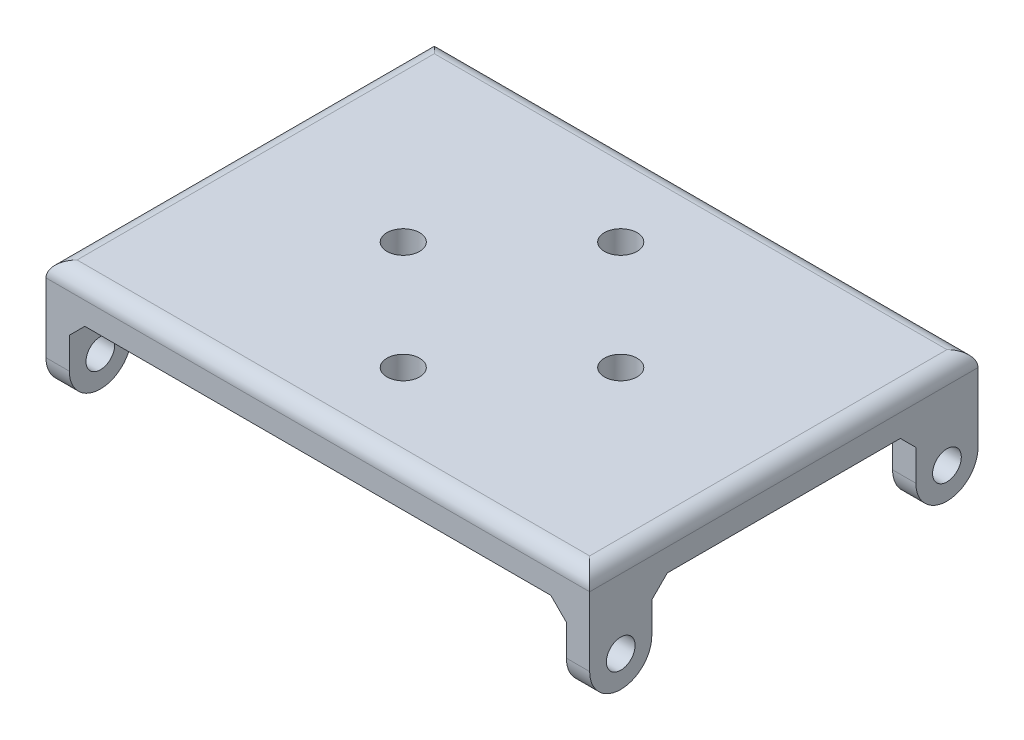
ISO-10303-21;
HEADER;
FILE_DESCRIPTION(('STEP AP214'),'2;1');
FILE_NAME('part.step','',(''),(''),'','','');
FILE_SCHEMA(('AUTOMOTIVE_DESIGN { 1 0 10303 214 1 1 1 1 }'));
ENDSEC;
DATA;
#1=APPLICATION_CONTEXT('core data for automotive mechanical design processes');
#2=APPLICATION_PROTOCOL_DEFINITION('international standard','automotive_design',2000,#1);
#3=PRODUCT_CONTEXT('',#1,'mechanical');
#4=PRODUCT('Part','Part','',(#3));
#5=PRODUCT_RELATED_PRODUCT_CATEGORY('part','',(#4));
#6=PRODUCT_DEFINITION_FORMATION('','',#4);
#7=PRODUCT_DEFINITION_CONTEXT('part definition',#1,'design');
#8=PRODUCT_DEFINITION('design','',#6,#7);
#9=PRODUCT_DEFINITION_SHAPE('','',#8);
#10=(LENGTH_UNIT() NAMED_UNIT(*) SI_UNIT(.MILLI.,.METRE.));
#11=(NAMED_UNIT(*) PLANE_ANGLE_UNIT() SI_UNIT($,.RADIAN.));
#12=(NAMED_UNIT(*) SI_UNIT($,.STERADIAN.) SOLID_ANGLE_UNIT());
#13=UNCERTAINTY_MEASURE_WITH_UNIT(LENGTH_MEASURE(1.E-05),#10,'distance_accuracy_value','');
#14=(GEOMETRIC_REPRESENTATION_CONTEXT(3) GLOBAL_UNCERTAINTY_ASSIGNED_CONTEXT((#13)) GLOBAL_UNIT_ASSIGNED_CONTEXT((#10,
#11,#12)) REPRESENTATION_CONTEXT('',''));
#15=CARTESIAN_POINT('',(0.,0.,0.));
#16=DIRECTION('',(0.,0.,1.));
#17=DIRECTION('',(1.,0.,0.));
#18=AXIS2_PLACEMENT_3D('',#15,#16,#17);
#19=CARTESIAN_POINT('',(0.,-1.225,0.));
#20=DIRECTION('',(0.,-1.,0.));
#21=DIRECTION('',(0.,0.,-1.));
#22=AXIS2_PLACEMENT_3D('',#19,#20,#21);
#23=PLANE('',#22);
#24=CARTESIAN_POINT('',(0.,-1.225,-7.));
#25=DIRECTION('',(0.,-1.,0.));
#26=DIRECTION('',(0.,0.,-1.));
#27=AXIS2_PLACEMENT_3D('',#24,#25,#26);
#28=CIRCLE('',#27,1.05);
#29=CARTESIAN_POINT('',(0.,-1.225,-8.05));
#30=VERTEX_POINT('',#29);
#31=EDGE_CURVE('E410',#30,#30,#28,.T.);
#32=ORIENTED_EDGE('',*,*,#31,.F.);
#33=EDGE_LOOP('',(#32));
#34=FACE_BOUND('',#33,.T.);
#35=CARTESIAN_POINT('',(7.,-1.225,0.));
#36=DIRECTION('',(0.,-1.,0.));
#37=DIRECTION('',(0.,0.,-1.));
#38=AXIS2_PLACEMENT_3D('',#35,#36,#37);
#39=CIRCLE('',#38,1.05);
#40=CARTESIAN_POINT('',(7.,-1.225,-1.05));
#41=VERTEX_POINT('',#40);
#42=EDGE_CURVE('E917',#41,#41,#39,.T.);
#43=ORIENTED_EDGE('',*,*,#42,.F.);
#44=EDGE_LOOP('',(#43));
#45=FACE_BOUND('',#44,.T.);
#46=CARTESIAN_POINT('',(-7.,-1.225,0.));
#47=DIRECTION('',(0.,-1.,0.));
#48=DIRECTION('',(0.,0.,-1.));
#49=AXIS2_PLACEMENT_3D('',#46,#47,#48);
#50=CIRCLE('',#49,1.05);
#51=CARTESIAN_POINT('',(-7.,-1.225,-1.05));
#52=VERTEX_POINT('',#51);
#53=EDGE_CURVE('E904',#52,#52,#50,.T.);
#54=ORIENTED_EDGE('',*,*,#53,.F.);
#55=EDGE_LOOP('',(#54));
#56=FACE_BOUND('',#55,.T.);
#57=CARTESIAN_POINT('',(0.,-1.225,7.));
#58=DIRECTION('',(0.,-1.,0.));
#59=DIRECTION('',(0.,0.,-1.));
#60=AXIS2_PLACEMENT_3D('',#57,#58,#59);
#61=CIRCLE('',#60,1.05);
#62=CARTESIAN_POINT('',(0.,-1.225,5.95));
#63=VERTEX_POINT('',#62);
#64=EDGE_CURVE('E900',#63,#63,#61,.T.);
#65=ORIENTED_EDGE('',*,*,#64,.F.);
#66=EDGE_LOOP('',(#65));
#67=FACE_BOUND('',#66,.T.);
#68=DIRECTION('',(-1.,0.,0.));
#69=VECTOR('',#68,1.);
#70=CARTESIAN_POINT('',(-17.5,-1.225,-12.5));
#71=LINE('',#70,#69);
#72=CARTESIAN_POINT('',(15.,-1.225,-12.5));
#73=VERTEX_POINT('',#72);
#74=CARTESIAN_POINT('',(-15.,-1.225,-12.5));
#75=VERTEX_POINT('',#74);
#76=EDGE_CURVE('E306',#73,#75,#71,.T.);
#77=ORIENTED_EDGE('',*,*,#76,.F.);
#78=DIRECTION('',(0.,0.,1.));
#79=VECTOR('',#78,1.);
#80=CARTESIAN_POINT('',(15.,-1.225,0.));
#81=LINE('',#80,#79);
#82=CARTESIAN_POINT('',(15.,-1.225,-7.49999999999999));
#83=VERTEX_POINT('',#82);
#84=EDGE_CURVE('E352',#73,#83,#81,.T.);
#85=ORIENTED_EDGE('',*,*,#84,.T.);
#86=DIRECTION('',(1.,0.,0.));
#87=VECTOR('',#86,1.);
#88=CARTESIAN_POINT('',(0.,-1.225,-7.49999999999999));
#89=LINE('',#88,#87);
#90=CARTESIAN_POINT('',(17.5,-1.225,-7.49999999999999));
#91=VERTEX_POINT('',#90);
#92=EDGE_CURVE('E350',#83,#91,#89,.T.);
#93=ORIENTED_EDGE('',*,*,#92,.T.);
#94=DIRECTION('',(0.,0.,-1.));
#95=VECTOR('',#94,1.);
#96=CARTESIAN_POINT('',(17.5,-1.225,12.5));
#97=LINE('',#96,#95);
#98=CARTESIAN_POINT('',(17.5,-1.225,7.50000000000001));
#99=VERTEX_POINT('',#98);
#100=EDGE_CURVE('E301',#99,#91,#97,.T.);
#101=ORIENTED_EDGE('',*,*,#100,.F.);
#102=DIRECTION('',(-1.,0.,0.));
#103=VECTOR('',#102,1.);
#104=CARTESIAN_POINT('',(0.,-1.225,7.50000000000001));
#105=LINE('',#104,#103);
#106=CARTESIAN_POINT('',(15.,-1.225,7.50000000000001));
#107=VERTEX_POINT('',#106);
#108=EDGE_CURVE('E346',#99,#107,#105,.T.);
#109=ORIENTED_EDGE('',*,*,#108,.T.);
#110=DIRECTION('',(0.,0.,1.));
#111=VECTOR('',#110,1.);
#112=CARTESIAN_POINT('',(15.,-1.225,12.5));
#113=LINE('',#112,#111);
#114=CARTESIAN_POINT('',(15.,-1.225,12.5));
#115=VERTEX_POINT('',#114);
#116=EDGE_CURVE('E348',#107,#115,#113,.T.);
#117=ORIENTED_EDGE('',*,*,#116,.T.);
#118=DIRECTION('',(1.,0.,0.));
#119=VECTOR('',#118,1.);
#120=CARTESIAN_POINT('',(-17.5,-1.225,12.5));
#121=LINE('',#120,#119);
#122=CARTESIAN_POINT('',(-15.,-1.225,12.5));
#123=VERTEX_POINT('',#122);
#124=EDGE_CURVE('E312',#123,#115,#121,.T.);
#125=ORIENTED_EDGE('',*,*,#124,.F.);
#126=DIRECTION('',(0.,0.,-1.));
#127=VECTOR('',#126,1.);
#128=CARTESIAN_POINT('',(-15.,-1.225,8.5));
#129=LINE('',#128,#127);
#130=CARTESIAN_POINT('',(-15.,-1.225,7.49999999999999));
#131=VERTEX_POINT('',#130);
#132=EDGE_CURVE('E343',#123,#131,#129,.T.);
#133=ORIENTED_EDGE('',*,*,#132,.T.);
#134=DIRECTION('',(-1.,0.,0.));
#135=VECTOR('',#134,1.);
#136=CARTESIAN_POINT('',(-17.5,-1.225,7.49999999999999));
#137=LINE('',#136,#135);
#138=CARTESIAN_POINT('',(-17.5,-1.225,7.49999999999999));
#139=VERTEX_POINT('',#138);
#140=EDGE_CURVE('E341',#131,#139,#137,.T.);
#141=ORIENTED_EDGE('',*,*,#140,.T.);
#142=DIRECTION('',(0.,0.,1.));
#143=VECTOR('',#142,1.);
#144=CARTESIAN_POINT('',(-17.5,-1.225,12.5));
#145=LINE('',#144,#143);
#146=CARTESIAN_POINT('',(-17.5,-1.225,-7.5));
#147=VERTEX_POINT('',#146);
#148=EDGE_CURVE('E309',#147,#139,#145,.T.);
#149=ORIENTED_EDGE('',*,*,#148,.F.);
#150=DIRECTION('',(1.,0.,0.));
#151=VECTOR('',#150,1.);
#152=CARTESIAN_POINT('',(-16.,-1.225,-7.5));
#153=LINE('',#152,#151);
#154=CARTESIAN_POINT('',(-15.,-1.225,-7.5));
#155=VERTEX_POINT('',#154);
#156=EDGE_CURVE('E336',#147,#155,#153,.T.);
#157=ORIENTED_EDGE('',*,*,#156,.T.);
#158=DIRECTION('',(0.,0.,-1.));
#159=VECTOR('',#158,1.);
#160=CARTESIAN_POINT('',(-15.,-1.225,0.));
#161=LINE('',#160,#159);
#162=EDGE_CURVE('E338',#155,#75,#161,.T.);
#163=ORIENTED_EDGE('',*,*,#162,.T.);
#164=EDGE_LOOP('',(#77,#85,#93,#101,#109,#117,#125,#133,#141,#149,#157,#163));
#165=FACE_BOUND('',#164,.T.);
#166=ADVANCED_FACE('F41',(#34,#45,#56,#67,#165),#23,.T.);
#167=CARTESIAN_POINT('',(17.5,1.225,12.5));
#168=DIRECTION('',(-1.,0.,0.));
#169=DIRECTION('',(0.,0.,1.));
#170=AXIS2_PLACEMENT_3D('',#167,#168,#169);
#171=PLANE('',#170);
#172=CARTESIAN_POINT('',(17.5,-4.225,-10.5));
#173=DIRECTION('',(-1.,0.,0.));
#174=DIRECTION('',(0.,0.,1.));
#175=AXIS2_PLACEMENT_3D('',#172,#173,#174);
#176=CIRCLE('',#175,0.925000000000001);
#177=CARTESIAN_POINT('',(17.5,-4.225,-9.575));
#178=VERTEX_POINT('',#177);
#179=EDGE_CURVE('E331',#178,#178,#176,.T.);
#180=ORIENTED_EDGE('',*,*,#179,.T.);
#181=EDGE_LOOP('',(#180));
#182=FACE_BOUND('',#181,.T.);
#183=CARTESIAN_POINT('',(17.5,-4.225,10.5));
#184=DIRECTION('',(-1.,0.,0.));
#185=DIRECTION('',(0.,0.,-1.));
#186=AXIS2_PLACEMENT_3D('',#183,#184,#185);
#187=CIRCLE('',#186,0.925000000000001);
#188=CARTESIAN_POINT('',(17.5,-4.225,9.575));
#189=VERTEX_POINT('',#188);
#190=EDGE_CURVE('E232',#189,#189,#187,.T.);
#191=ORIENTED_EDGE('',*,*,#190,.T.);
#192=EDGE_LOOP('',(#191));
#193=FACE_BOUND('',#192,.T.);
#194=DIRECTION('',(0.,-1.,0.));
#195=VECTOR('',#194,1.);
#196=CARTESIAN_POINT('',(17.5,1.225,-12.5));
#197=LINE('',#196,#195);
#198=CARTESIAN_POINT('',(17.5,0.225,-12.5));
#199=VERTEX_POINT('',#198);
#200=CARTESIAN_POINT('',(17.5,-4.225,-12.5));
#201=VERTEX_POINT('',#200);
#202=EDGE_CURVE('E321',#199,#201,#197,.T.);
#203=ORIENTED_EDGE('',*,*,#202,.F.);
#204=DIRECTION('',(0.,0.,-1.));
#205=VECTOR('',#204,1.);
#206=CARTESIAN_POINT('',(17.5,0.225,12.5));
#207=LINE('',#206,#205);
#208=CARTESIAN_POINT('',(17.5,0.225,12.5));
#209=VERTEX_POINT('',#208);
#210=EDGE_CURVE('E50',#199,#209,#207,.F.);
#211=ORIENTED_EDGE('',*,*,#210,.T.);
#212=DIRECTION('',(0.,-1.,0.));
#213=VECTOR('',#212,1.);
#214=CARTESIAN_POINT('',(17.5,1.225,12.5));
#215=LINE('',#214,#213);
#216=CARTESIAN_POINT('',(17.5,-4.225,12.5));
#217=VERTEX_POINT('',#216);
#218=EDGE_CURVE('E315',#209,#217,#215,.T.);
#219=ORIENTED_EDGE('',*,*,#218,.T.);
#220=CARTESIAN_POINT('',(17.5,-4.225,10.5));
#221=DIRECTION('',(-1.,0.,0.));
#222=DIRECTION('',(0.,0.,-1.));
#223=AXIS2_PLACEMENT_3D('',#220,#221,#222);
#224=CIRCLE('',#223,2.);
#225=CARTESIAN_POINT('',(17.5,-4.225,8.5));
#226=VERTEX_POINT('',#225);
#227=EDGE_CURVE('E229',#226,#217,#224,.T.);
#228=ORIENTED_EDGE('',*,*,#227,.F.);
#229=DIRECTION('',(0.,-1.,0.));
#230=VECTOR('',#229,1.);
#231=CARTESIAN_POINT('',(17.5,-4.225,8.5));
#232=LINE('',#231,#230);
#233=CARTESIAN_POINT('',(17.5,-2.225,8.5));
#234=VERTEX_POINT('',#233);
#235=EDGE_CURVE('E220',#234,#226,#232,.T.);
#236=ORIENTED_EDGE('',*,*,#235,.F.);
#237=DIRECTION('',(0.,0.70710678118655,-0.707106781186545));
#238=VECTOR('',#237,1.);
#239=CARTESIAN_POINT('',(17.5,-2.49999999999998,8.77499999999998));
#240=LINE('',#239,#238);
#241=EDGE_CURVE('E373',#234,#99,#240,.T.);
#242=ORIENTED_EDGE('',*,*,#241,.T.);
#243=ORIENTED_EDGE('',*,*,#100,.T.);
#244=DIRECTION('',(0.,-0.707106781186543,-0.707106781186552));
#245=VECTOR('',#244,1.);
#246=CARTESIAN_POINT('',(17.5,9.99999999999998,3.72500000000014));
#247=LINE('',#246,#245);
#248=CARTESIAN_POINT('',(17.5,-2.225,-8.5));
#249=VERTEX_POINT('',#248);
#250=EDGE_CURVE('E369',#91,#249,#247,.T.);
#251=ORIENTED_EDGE('',*,*,#250,.T.);
#252=DIRECTION('',(0.,1.,0.));
#253=VECTOR('',#252,1.);
#254=CARTESIAN_POINT('',(17.5,-4.225,-8.5));
#255=LINE('',#254,#253);
#256=CARTESIAN_POINT('',(17.5,-4.225,-8.5));
#257=VERTEX_POINT('',#256);
#258=EDGE_CURVE('E238',#257,#249,#255,.T.);
#259=ORIENTED_EDGE('',*,*,#258,.F.);
#260=CARTESIAN_POINT('',(17.5,-4.225,-10.5));
#261=DIRECTION('',(-1.,0.,0.));
#262=DIRECTION('',(0.,0.,1.));
#263=AXIS2_PLACEMENT_3D('',#260,#261,#262);
#264=CIRCLE('',#263,2.);
#265=EDGE_CURVE('E244',#201,#257,#264,.T.);
#266=ORIENTED_EDGE('',*,*,#265,.F.);
#267=EDGE_LOOP('',(#203,#211,#219,#228,#236,#242,#243,#251,#259,#266));
#268=FACE_BOUND('',#267,.T.);
#269=ADVANCED_FACE('F456',(#182,#193,#268),#171,.F.);
#270=CARTESIAN_POINT('',(-17.5,1.225,-12.5));
#271=DIRECTION('',(0.,0.,1.));
#272=DIRECTION('',(1.,0.,0.));
#273=AXIS2_PLACEMENT_3D('',#270,#271,#272);
#274=PLANE('',#273);
#275=DIRECTION('',(0.,-1.,0.));
#276=VECTOR('',#275,1.);
#277=CARTESIAN_POINT('',(-17.5,1.225,-12.5));
#278=LINE('',#277,#276);
#279=CARTESIAN_POINT('',(-17.5,0.225,-12.5));
#280=VERTEX_POINT('',#279);
#281=CARTESIAN_POINT('',(-17.5,-4.225,-12.5));
#282=VERTEX_POINT('',#281);
#283=EDGE_CURVE('E319',#280,#282,#278,.T.);
#284=ORIENTED_EDGE('',*,*,#283,.F.);
#285=DIRECTION('',(-1.,0.,0.));
#286=VECTOR('',#285,1.);
#287=CARTESIAN_POINT('',(-17.5,0.225,-12.5));
#288=LINE('',#287,#286);
#289=EDGE_CURVE('E65',#280,#199,#288,.F.);
#290=ORIENTED_EDGE('',*,*,#289,.T.);
#291=ORIENTED_EDGE('',*,*,#202,.T.);
#292=DIRECTION('',(1.,0.,0.));
#293=VECTOR('',#292,1.);
#294=CARTESIAN_POINT('',(16.,-4.225,-12.5));
#295=LINE('',#294,#293);
#296=CARTESIAN_POINT('',(16.,-4.225,-12.5));
#297=VERTEX_POINT('',#296);
#298=EDGE_CURVE('E252',#297,#201,#295,.T.);
#299=ORIENTED_EDGE('',*,*,#298,.F.);
#300=DIRECTION('',(0.,-1.,0.));
#301=VECTOR('',#300,1.);
#302=CARTESIAN_POINT('',(16.,-1.225,-12.5));
#303=LINE('',#302,#301);
#304=CARTESIAN_POINT('',(16.,-2.225,-12.5));
#305=VERTEX_POINT('',#304);
#306=EDGE_CURVE('E246',#305,#297,#303,.T.);
#307=ORIENTED_EDGE('',*,*,#306,.F.);
#308=DIRECTION('',(-0.707106781186552,0.707106781186543,0.));
#309=VECTOR('',#308,1.);
#310=CARTESIAN_POINT('',(-2.47500000000023,16.25,-12.5));
#311=LINE('',#310,#309);
#312=EDGE_CURVE('E367',#305,#73,#311,.T.);
#313=ORIENTED_EDGE('',*,*,#312,.T.);
#314=ORIENTED_EDGE('',*,*,#76,.T.);
#315=DIRECTION('',(-0.707106781186545,-0.70710678118655,0.));
#316=VECTOR('',#315,1.);
#317=CARTESIAN_POINT('',(-15.025,-1.24999999999999,-12.5));
#318=LINE('',#317,#316);
#319=CARTESIAN_POINT('',(-16.,-2.22500000000001,-12.5));
#320=VERTEX_POINT('',#319);
#321=EDGE_CURVE('E379',#75,#320,#318,.T.);
#322=ORIENTED_EDGE('',*,*,#321,.T.);
#323=DIRECTION('',(0.,-1.,0.));
#324=VECTOR('',#323,1.);
#325=CARTESIAN_POINT('',(-16.,-1.225,-12.5));
#326=LINE('',#325,#324);
#327=CARTESIAN_POINT('',(-16.,-4.225,-12.5));
#328=VERTEX_POINT('',#327);
#329=EDGE_CURVE('E285',#320,#328,#326,.T.);
#330=ORIENTED_EDGE('',*,*,#329,.T.);
#331=DIRECTION('',(-1.,0.,0.));
#332=VECTOR('',#331,1.);
#333=CARTESIAN_POINT('',(-16.,-4.225,-12.5));
#334=LINE('',#333,#332);
#335=EDGE_CURVE('E294',#328,#282,#334,.T.);
#336=ORIENTED_EDGE('',*,*,#335,.T.);
#337=EDGE_LOOP('',(#284,#290,#291,#299,#307,#313,#314,#322,#330,#336));
#338=FACE_BOUND('',#337,.T.);
#339=ADVANCED_FACE('F461',(#338),#274,.F.);
#340=CARTESIAN_POINT('',(-17.5,1.225,12.5));
#341=DIRECTION('',(1.,0.,0.));
#342=DIRECTION('',(0.,0.,-1.));
#343=AXIS2_PLACEMENT_3D('',#340,#341,#342);
#344=PLANE('',#343);
#345=CARTESIAN_POINT('',(-17.5,-4.225,-10.5));
#346=DIRECTION('',(-1.,0.,0.));
#347=DIRECTION('',(0.,0.,1.));
#348=AXIS2_PLACEMENT_3D('',#345,#346,#347);
#349=CIRCLE('',#348,0.925000000000001);
#350=CARTESIAN_POINT('',(-17.5,-4.225,-9.575));
#351=VERTEX_POINT('',#350);
#352=EDGE_CURVE('E258',#351,#351,#349,.T.);
#353=ORIENTED_EDGE('',*,*,#352,.F.);
#354=EDGE_LOOP('',(#353));
#355=FACE_BOUND('',#354,.T.);
#356=CARTESIAN_POINT('',(-17.5,-4.225,10.5));
#357=DIRECTION('',(-1.,0.,0.));
#358=DIRECTION('',(0.,0.,-1.));
#359=AXIS2_PLACEMENT_3D('',#356,#357,#358);
#360=CIRCLE('',#359,0.925000000000001);
#361=CARTESIAN_POINT('',(-17.5,-4.225,9.575));
#362=VERTEX_POINT('',#361);
#363=EDGE_CURVE('E255',#362,#362,#360,.T.);
#364=ORIENTED_EDGE('',*,*,#363,.F.);
#365=EDGE_LOOP('',(#364));
#366=FACE_BOUND('',#365,.T.);
#367=DIRECTION('',(0.,-1.,0.));
#368=VECTOR('',#367,1.);
#369=CARTESIAN_POINT('',(-17.5,1.225,12.5));
#370=LINE('',#369,#368);
#371=CARTESIAN_POINT('',(-17.5,0.225,12.5));
#372=VERTEX_POINT('',#371);
#373=CARTESIAN_POINT('',(-17.5,-4.225,12.5));
#374=VERTEX_POINT('',#373);
#375=EDGE_CURVE('E317',#372,#374,#370,.T.);
#376=ORIENTED_EDGE('',*,*,#375,.F.);
#377=DIRECTION('',(0.,0.,1.));
#378=VECTOR('',#377,1.);
#379=CARTESIAN_POINT('',(-17.5,0.225,12.5));
#380=LINE('',#379,#378);
#381=EDGE_CURVE('E402',#372,#280,#380,.F.);
#382=ORIENTED_EDGE('',*,*,#381,.T.);
#383=ORIENTED_EDGE('',*,*,#283,.T.);
#384=CARTESIAN_POINT('',(-17.5,-4.225,-10.5));
#385=DIRECTION('',(-1.,0.,0.));
#386=DIRECTION('',(0.,0.,1.));
#387=AXIS2_PLACEMENT_3D('',#384,#385,#386);
#388=CIRCLE('',#387,2.);
#389=CARTESIAN_POINT('',(-17.5,-4.225,-8.5));
#390=VERTEX_POINT('',#389);
#391=EDGE_CURVE('E278',#282,#390,#388,.T.);
#392=ORIENTED_EDGE('',*,*,#391,.T.);
#393=DIRECTION('',(0.,1.,0.));
#394=VECTOR('',#393,1.);
#395=CARTESIAN_POINT('',(-17.5,-4.225,-8.5));
#396=LINE('',#395,#394);
#397=CARTESIAN_POINT('',(-17.5,-2.22500000000001,-8.5));
#398=VERTEX_POINT('',#397);
#399=EDGE_CURVE('E288',#390,#398,#396,.T.);
#400=ORIENTED_EDGE('',*,*,#399,.T.);
#401=DIRECTION('',(0.,-0.707106781186551,-0.707106781186545));
#402=VECTOR('',#401,1.);
#403=CARTESIAN_POINT('',(-17.5,10.,3.72499999999992));
#404=LINE('',#403,#402);
#405=EDGE_CURVE('E381',#398,#147,#404,.F.);
#406=ORIENTED_EDGE('',*,*,#405,.T.);
#407=ORIENTED_EDGE('',*,*,#148,.T.);
#408=DIRECTION('',(0.,0.707106781186543,-0.707106781186552));
#409=VECTOR('',#408,1.);
#410=CARTESIAN_POINT('',(-17.5,-2.50000000000002,8.77500000000003));
#411=LINE('',#410,#409);
#412=CARTESIAN_POINT('',(-17.5,-2.225,8.5));
#413=VERTEX_POINT('',#412);
#414=EDGE_CURVE('E377',#139,#413,#411,.F.);
#415=ORIENTED_EDGE('',*,*,#414,.T.);
#416=DIRECTION('',(0.,-1.,0.));
#417=VECTOR('',#416,1.);
#418=CARTESIAN_POINT('',(-17.5,-4.225,8.5));
#419=LINE('',#418,#417);
#420=CARTESIAN_POINT('',(-17.5,-4.225,8.5));
#421=VERTEX_POINT('',#420);
#422=EDGE_CURVE('E272',#413,#421,#419,.T.);
#423=ORIENTED_EDGE('',*,*,#422,.T.);
#424=CARTESIAN_POINT('',(-17.5,-4.225,10.5));
#425=DIRECTION('',(-1.,0.,0.));
#426=DIRECTION('',(0.,0.,-1.));
#427=AXIS2_PLACEMENT_3D('',#424,#425,#426);
#428=CIRCLE('',#427,2.);
#429=EDGE_CURVE('E274',#421,#374,#428,.T.);
#430=ORIENTED_EDGE('',*,*,#429,.T.);
#431=EDGE_LOOP('',(#376,#382,#383,#392,#400,#406,#407,#415,#423,#430));
#432=FACE_BOUND('',#431,.T.);
#433=ADVANCED_FACE('F432',(#355,#366,#432),#344,.F.);
#434=CARTESIAN_POINT('',(-17.5,1.225,12.5));
#435=DIRECTION('',(0.,0.,-1.));
#436=DIRECTION('',(-1.,0.,0.));
#437=AXIS2_PLACEMENT_3D('',#434,#435,#436);
#438=PLANE('',#437);
#439=ORIENTED_EDGE('',*,*,#218,.F.);
#440=DIRECTION('',(1.,0.,0.));
#441=VECTOR('',#440,1.);
#442=CARTESIAN_POINT('',(-17.5,0.225,12.5));
#443=LINE('',#442,#441);
#444=EDGE_CURVE('E11',#209,#372,#443,.F.);
#445=ORIENTED_EDGE('',*,*,#444,.T.);
#446=ORIENTED_EDGE('',*,*,#375,.T.);
#447=DIRECTION('',(-1.,0.,0.));
#448=VECTOR('',#447,1.);
#449=CARTESIAN_POINT('',(-16.,-4.225,12.5));
#450=LINE('',#449,#448);
#451=CARTESIAN_POINT('',(-16.,-4.225,12.5));
#452=VERTEX_POINT('',#451);
#453=EDGE_CURVE('E264',#452,#374,#450,.T.);
#454=ORIENTED_EDGE('',*,*,#453,.F.);
#455=DIRECTION('',(0.,1.,0.));
#456=VECTOR('',#455,1.);
#457=CARTESIAN_POINT('',(-16.,-1.225,12.5));
#458=LINE('',#457,#456);
#459=CARTESIAN_POINT('',(-16.,-2.225,12.5));
#460=VERTEX_POINT('',#459);
#461=EDGE_CURVE('E280',#452,#460,#458,.T.);
#462=ORIENTED_EDGE('',*,*,#461,.T.);
#463=DIRECTION('',(-0.707106781186552,-0.707106781186543,0.));
#464=VECTOR('',#463,1.);
#465=CARTESIAN_POINT('',(-15.025,-1.25000000000002,12.5));
#466=LINE('',#465,#464);
#467=EDGE_CURVE('E375',#460,#123,#466,.F.);
#468=ORIENTED_EDGE('',*,*,#467,.T.);
#469=ORIENTED_EDGE('',*,*,#124,.T.);
#470=DIRECTION('',(-0.707106781186545,0.70710678118655,0.));
#471=VECTOR('',#470,1.);
#472=CARTESIAN_POINT('',(-2.47499999999987,16.25,12.5));
#473=LINE('',#472,#471);
#474=CARTESIAN_POINT('',(16.,-2.225,12.5));
#475=VERTEX_POINT('',#474);
#476=EDGE_CURVE('E371',#115,#475,#473,.F.);
#477=ORIENTED_EDGE('',*,*,#476,.T.);
#478=DIRECTION('',(0.,1.,0.));
#479=VECTOR('',#478,1.);
#480=CARTESIAN_POINT('',(16.,-1.225,12.5));
#481=LINE('',#480,#479);
#482=CARTESIAN_POINT('',(16.,-4.225,12.5));
#483=VERTEX_POINT('',#482);
#484=EDGE_CURVE('E214',#483,#475,#481,.T.);
#485=ORIENTED_EDGE('',*,*,#484,.F.);
#486=DIRECTION('',(1.,0.,0.));
#487=VECTOR('',#486,1.);
#488=CARTESIAN_POINT('',(16.,-4.225,12.5));
#489=LINE('',#488,#487);
#490=EDGE_CURVE('E224',#483,#217,#489,.T.);
#491=ORIENTED_EDGE('',*,*,#490,.T.);
#492=EDGE_LOOP('',(#439,#445,#446,#454,#462,#468,#469,#477,#485,#491));
#493=FACE_BOUND('',#492,.T.);
#494=ADVANCED_FACE('F429',(#493),#438,.F.);
#495=CARTESIAN_POINT('',(0.,1.225,0.));
#496=DIRECTION('',(0.,-1.,0.));
#497=DIRECTION('',(0.,0.,-1.));
#498=AXIS2_PLACEMENT_3D('',#495,#496,#497);
#499=PLANE('',#498);
#500=CARTESIAN_POINT('',(0.,1.225,-7.));
#501=DIRECTION('',(0.,1.,0.));
#502=DIRECTION('',(0.,0.,1.));
#503=AXIS2_PLACEMENT_3D('',#500,#501,#502);
#504=CIRCLE('',#503,1.05);
#505=CARTESIAN_POINT('',(0.,1.225,-5.95));
#506=VERTEX_POINT('',#505);
#507=EDGE_CURVE('E899',#506,#506,#504,.T.);
#508=ORIENTED_EDGE('',*,*,#507,.F.);
#509=EDGE_LOOP('',(#508));
#510=FACE_BOUND('',#509,.T.);
#511=CARTESIAN_POINT('',(7.,1.225,0.));
#512=DIRECTION('',(0.,1.,0.));
#513=DIRECTION('',(0.,0.,1.));
#514=AXIS2_PLACEMENT_3D('',#511,#512,#513);
#515=CIRCLE('',#514,1.05);
#516=CARTESIAN_POINT('',(7.,1.225,1.05));
#517=VERTEX_POINT('',#516);
#518=EDGE_CURVE('E901',#517,#517,#515,.T.);
#519=ORIENTED_EDGE('',*,*,#518,.F.);
#520=EDGE_LOOP('',(#519));
#521=FACE_BOUND('',#520,.T.);
#522=CARTESIAN_POINT('',(-7.,1.225,0.));
#523=DIRECTION('',(0.,1.,0.));
#524=DIRECTION('',(0.,0.,1.));
#525=AXIS2_PLACEMENT_3D('',#522,#523,#524);
#526=CIRCLE('',#525,1.05);
#527=CARTESIAN_POINT('',(-7.,1.225,1.05));
#528=VERTEX_POINT('',#527);
#529=EDGE_CURVE('E907',#528,#528,#526,.T.);
#530=ORIENTED_EDGE('',*,*,#529,.F.);
#531=EDGE_LOOP('',(#530));
#532=FACE_BOUND('',#531,.T.);
#533=CARTESIAN_POINT('',(0.,1.225,7.));
#534=DIRECTION('',(0.,1.,0.));
#535=DIRECTION('',(0.,0.,1.));
#536=AXIS2_PLACEMENT_3D('',#533,#534,#535);
#537=CIRCLE('',#536,1.05);
#538=CARTESIAN_POINT('',(0.,1.225,8.05));
#539=VERTEX_POINT('',#538);
#540=EDGE_CURVE('E912',#539,#539,#537,.T.);
#541=ORIENTED_EDGE('',*,*,#540,.F.);
#542=EDGE_LOOP('',(#541));
#543=FACE_BOUND('',#542,.T.);
#544=DIRECTION('',(-1.,0.,0.));
#545=VECTOR('',#544,1.);
#546=CARTESIAN_POINT('',(0.,1.225,-11.5));
#547=LINE('',#546,#545);
#548=CARTESIAN_POINT('',(16.5,1.225,-11.5));
#549=VERTEX_POINT('',#548);
#550=CARTESIAN_POINT('',(-16.5,1.225,-11.5));
#551=VERTEX_POINT('',#550);
#552=EDGE_CURVE('E397',#549,#551,#547,.T.);
#553=ORIENTED_EDGE('',*,*,#552,.T.);
#554=DIRECTION('',(0.,0.,1.));
#555=VECTOR('',#554,1.);
#556=CARTESIAN_POINT('',(-16.5,1.225,0.));
#557=LINE('',#556,#555);
#558=CARTESIAN_POINT('',(-16.5,1.225,11.5));
#559=VERTEX_POINT('',#558);
#560=EDGE_CURVE('E399',#551,#559,#557,.T.);
#561=ORIENTED_EDGE('',*,*,#560,.T.);
#562=DIRECTION('',(1.,0.,0.));
#563=VECTOR('',#562,1.);
#564=CARTESIAN_POINT('',(0.,1.225,11.5));
#565=LINE('',#564,#563);
#566=CARTESIAN_POINT('',(16.5,1.225,11.5));
#567=VERTEX_POINT('',#566);
#568=EDGE_CURVE('E383',#559,#567,#565,.T.);
#569=ORIENTED_EDGE('',*,*,#568,.T.);
#570=DIRECTION('',(0.,0.,-1.));
#571=VECTOR('',#570,1.);
#572=CARTESIAN_POINT('',(16.5,1.225,0.));
#573=LINE('',#572,#571);
#574=EDGE_CURVE('E395',#567,#549,#573,.T.);
#575=ORIENTED_EDGE('',*,*,#574,.T.);
#576=EDGE_LOOP('',(#553,#561,#569,#575));
#577=FACE_BOUND('',#576,.T.);
#578=ADVANCED_FACE('F438',(#510,#521,#532,#543,#577),#499,.F.);
#579=CARTESIAN_POINT('',(-16.,-4.225,-8.5));
#580=DIRECTION('',(0.,0.,1.));
#581=DIRECTION('',(0.,-1.,0.));
#582=AXIS2_PLACEMENT_3D('',#579,#580,#581);
#583=PLANE('',#582);
#584=DIRECTION('',(0.,1.,0.));
#585=VECTOR('',#584,1.);
#586=CARTESIAN_POINT('',(-16.,-4.225,-8.5));
#587=LINE('',#586,#585);
#588=CARTESIAN_POINT('',(-16.,-4.225,-8.5));
#589=VERTEX_POINT('',#588);
#590=CARTESIAN_POINT('',(-16.,-2.22500000000001,-8.5));
#591=VERTEX_POINT('',#590);
#592=EDGE_CURVE('E291',#589,#591,#587,.T.);
#593=ORIENTED_EDGE('',*,*,#592,.T.);
#594=DIRECTION('',(-1.,0.,0.));
#595=VECTOR('',#594,1.);
#596=CARTESIAN_POINT('',(-17.5,-2.22500000000001,-8.5));
#597=LINE('',#596,#595);
#598=EDGE_CURVE('E365',#591,#398,#597,.T.);
#599=ORIENTED_EDGE('',*,*,#598,.T.);
#600=ORIENTED_EDGE('',*,*,#399,.F.);
#601=DIRECTION('',(-1.,0.,0.));
#602=VECTOR('',#601,1.);
#603=CARTESIAN_POINT('',(-16.,-4.225,-8.5));
#604=LINE('',#603,#602);
#605=EDGE_CURVE('E299',#589,#390,#604,.T.);
#606=ORIENTED_EDGE('',*,*,#605,.F.);
#607=EDGE_LOOP('',(#593,#599,#600,#606));
#608=FACE_BOUND('',#607,.T.);
#609=ADVANCED_FACE('F440',(#608),#583,.T.);
#610=CARTESIAN_POINT('',(-16.,-4.225,-10.5));
#611=DIRECTION('',(-1.,0.,0.));
#612=DIRECTION('',(0.,0.,1.));
#613=AXIS2_PLACEMENT_3D('',#610,#611,#612);
#614=CYLINDRICAL_SURFACE('',#613,2.);
#615=ORIENTED_EDGE('',*,*,#391,.F.);
#616=ORIENTED_EDGE('',*,*,#335,.F.);
#617=CARTESIAN_POINT('',(-16.,-4.225,-10.5));
#618=DIRECTION('',(-1.,0.,0.));
#619=DIRECTION('',(0.,0.,1.));
#620=AXIS2_PLACEMENT_3D('',#617,#618,#619);
#621=CIRCLE('',#620,2.);
#622=EDGE_CURVE('E287',#328,#589,#621,.T.);
#623=ORIENTED_EDGE('',*,*,#622,.T.);
#624=ORIENTED_EDGE('',*,*,#605,.T.);
#625=EDGE_LOOP('',(#615,#616,#623,#624));
#626=FACE_BOUND('',#625,.T.);
#627=ADVANCED_FACE('F447',(#626),#614,.T.);
#628=CARTESIAN_POINT('',(-16.,-4.225,-10.5));
#629=DIRECTION('',(-1.,0.,0.));
#630=DIRECTION('',(0.,0.,1.));
#631=AXIS2_PLACEMENT_3D('',#628,#629,#630);
#632=PLANE('',#631);
#633=CARTESIAN_POINT('',(-16.,-4.225,-10.5));
#634=DIRECTION('',(-1.,0.,0.));
#635=DIRECTION('',(0.,0.,1.));
#636=AXIS2_PLACEMENT_3D('',#633,#634,#635);
#637=CIRCLE('',#636,0.925000000000001);
#638=CARTESIAN_POINT('',(-16.,-4.225,-9.575));
#639=VERTEX_POINT('',#638);
#640=EDGE_CURVE('E271',#639,#639,#637,.T.);
#641=ORIENTED_EDGE('',*,*,#640,.T.);
#642=EDGE_LOOP('',(#641));
#643=FACE_BOUND('',#642,.T.);
#644=ORIENTED_EDGE('',*,*,#329,.F.);
#645=DIRECTION('',(0.,0.,1.));
#646=VECTOR('',#645,1.);
#647=CARTESIAN_POINT('',(-16.,-2.22500000000001,-10.5));
#648=LINE('',#647,#646);
#649=EDGE_CURVE('E363',#320,#591,#648,.T.);
#650=ORIENTED_EDGE('',*,*,#649,.T.);
#651=ORIENTED_EDGE('',*,*,#592,.F.);
#652=ORIENTED_EDGE('',*,*,#622,.F.);
#653=EDGE_LOOP('',(#644,#650,#651,#652));
#654=FACE_BOUND('',#653,.T.);
#655=ADVANCED_FACE('F672',(#643,#654),#632,.F.);
#656=CARTESIAN_POINT('',(-16.,-4.225,10.5));
#657=DIRECTION('',(-1.,0.,0.));
#658=DIRECTION('',(0.,0.,1.));
#659=AXIS2_PLACEMENT_3D('',#656,#657,#658);
#660=CYLINDRICAL_SURFACE('',#659,2.);
#661=ORIENTED_EDGE('',*,*,#429,.F.);
#662=DIRECTION('',(-1.,0.,0.));
#663=VECTOR('',#662,1.);
#664=CARTESIAN_POINT('',(-16.,-4.225,8.5));
#665=LINE('',#664,#663);
#666=CARTESIAN_POINT('',(-16.,-4.225,8.5));
#667=VERTEX_POINT('',#666);
#668=EDGE_CURVE('E268',#667,#421,#665,.T.);
#669=ORIENTED_EDGE('',*,*,#668,.F.);
#670=CARTESIAN_POINT('',(-16.,-4.225,10.5));
#671=DIRECTION('',(-1.,0.,0.));
#672=DIRECTION('',(0.,0.,-1.));
#673=AXIS2_PLACEMENT_3D('',#670,#671,#672);
#674=CIRCLE('',#673,2.);
#675=EDGE_CURVE('E275',#667,#452,#674,.T.);
#676=ORIENTED_EDGE('',*,*,#675,.T.);
#677=ORIENTED_EDGE('',*,*,#453,.T.);
#678=EDGE_LOOP('',(#661,#669,#676,#677));
#679=FACE_BOUND('',#678,.T.);
#680=ADVANCED_FACE('F664',(#679),#660,.T.);
#681=CARTESIAN_POINT('',(-16.,-4.225,8.5));
#682=DIRECTION('',(0.,0.,-1.));
#683=DIRECTION('',(0.,1.,0.));
#684=AXIS2_PLACEMENT_3D('',#681,#682,#683);
#685=PLANE('',#684);
#686=ORIENTED_EDGE('',*,*,#422,.F.);
#687=DIRECTION('',(1.,0.,0.));
#688=VECTOR('',#687,1.);
#689=CARTESIAN_POINT('',(-16.,-2.225,8.5));
#690=LINE('',#689,#688);
#691=CARTESIAN_POINT('',(-16.,-2.225,8.5));
#692=VERTEX_POINT('',#691);
#693=EDGE_CURVE('E361',#413,#692,#690,.T.);
#694=ORIENTED_EDGE('',*,*,#693,.T.);
#695=DIRECTION('',(0.,-1.,0.));
#696=VECTOR('',#695,1.);
#697=CARTESIAN_POINT('',(-16.,-4.225,8.5));
#698=LINE('',#697,#696);
#699=EDGE_CURVE('E267',#692,#667,#698,.T.);
#700=ORIENTED_EDGE('',*,*,#699,.T.);
#701=ORIENTED_EDGE('',*,*,#668,.T.);
#702=EDGE_LOOP('',(#686,#694,#700,#701));
#703=FACE_BOUND('',#702,.T.);
#704=ADVANCED_FACE('F656',(#703),#685,.T.);
#705=CARTESIAN_POINT('',(-16.,-4.225,10.5));
#706=DIRECTION('',(1.,0.,0.));
#707=DIRECTION('',(0.,0.,-1.));
#708=AXIS2_PLACEMENT_3D('',#705,#706,#707);
#709=PLANE('',#708);
#710=CARTESIAN_POINT('',(-16.,-4.225,10.5));
#711=DIRECTION('',(1.,0.,0.));
#712=DIRECTION('',(0.,0.,-1.));
#713=AXIS2_PLACEMENT_3D('',#710,#711,#712);
#714=CIRCLE('',#713,0.925000000000001);
#715=CARTESIAN_POINT('',(-16.,-4.225,9.575));
#716=VERTEX_POINT('',#715);
#717=EDGE_CURVE('E261',#716,#716,#714,.T.);
#718=ORIENTED_EDGE('',*,*,#717,.F.);
#719=EDGE_LOOP('',(#718));
#720=FACE_BOUND('',#719,.T.);
#721=ORIENTED_EDGE('',*,*,#699,.F.);
#722=DIRECTION('',(0.,0.,1.));
#723=VECTOR('',#722,1.);
#724=CARTESIAN_POINT('',(-16.,-2.225,12.5));
#725=LINE('',#724,#723);
#726=EDGE_CURVE('E359',#692,#460,#725,.T.);
#727=ORIENTED_EDGE('',*,*,#726,.T.);
#728=ORIENTED_EDGE('',*,*,#461,.F.);
#729=ORIENTED_EDGE('',*,*,#675,.F.);
#730=EDGE_LOOP('',(#721,#727,#728,#729));
#731=FACE_BOUND('',#730,.T.);
#732=ADVANCED_FACE('F648',(#720,#731),#709,.T.);
#733=CARTESIAN_POINT('',(17.5,-4.225,10.5));
#734=DIRECTION('',(-1.,0.,0.));
#735=DIRECTION('',(0.,0.,1.));
#736=AXIS2_PLACEMENT_3D('',#733,#734,#735);
#737=CYLINDRICAL_SURFACE('',#736,0.925000000000001);
#738=ORIENTED_EDGE('',*,*,#717,.T.);
#739=EDGE_LOOP('',(#738));
#740=FACE_BOUND('',#739,.T.);
#741=ORIENTED_EDGE('',*,*,#363,.T.);
#742=EDGE_LOOP('',(#741));
#743=FACE_BOUND('',#742,.T.);
#744=ADVANCED_FACE('F640',(#740,#743),#737,.F.);
#745=CARTESIAN_POINT('',(17.5,-4.225,-10.5));
#746=DIRECTION('',(-1.,0.,0.));
#747=DIRECTION('',(0.,0.,1.));
#748=AXIS2_PLACEMENT_3D('',#745,#746,#747);
#749=CYLINDRICAL_SURFACE('',#748,0.925000000000001);
#750=ORIENTED_EDGE('',*,*,#352,.T.);
#751=EDGE_LOOP('',(#750));
#752=FACE_BOUND('',#751,.T.);
#753=ORIENTED_EDGE('',*,*,#640,.F.);
#754=EDGE_LOOP('',(#753));
#755=FACE_BOUND('',#754,.T.);
#756=ADVANCED_FACE('F632',(#752,#755),#749,.F.);
#757=CARTESIAN_POINT('',(16.,-4.225,-10.5));
#758=DIRECTION('',(1.,0.,0.));
#759=DIRECTION('',(0.,0.,-1.));
#760=AXIS2_PLACEMENT_3D('',#757,#758,#759);
#761=CYLINDRICAL_SURFACE('',#760,2.);
#762=ORIENTED_EDGE('',*,*,#265,.T.);
#763=DIRECTION('',(1.,0.,0.));
#764=VECTOR('',#763,1.);
#765=CARTESIAN_POINT('',(16.,-4.225,-8.5));
#766=LINE('',#765,#764);
#767=CARTESIAN_POINT('',(16.,-4.225,-8.5));
#768=VERTEX_POINT('',#767);
#769=EDGE_CURVE('E248',#768,#257,#766,.T.);
#770=ORIENTED_EDGE('',*,*,#769,.F.);
#771=CARTESIAN_POINT('',(16.,-4.225,-10.5));
#772=DIRECTION('',(-1.,0.,0.));
#773=DIRECTION('',(0.,0.,1.));
#774=AXIS2_PLACEMENT_3D('',#771,#772,#773);
#775=CIRCLE('',#774,2.);
#776=EDGE_CURVE('E243',#297,#768,#775,.T.);
#777=ORIENTED_EDGE('',*,*,#776,.F.);
#778=ORIENTED_EDGE('',*,*,#298,.T.);
#779=EDGE_LOOP('',(#762,#770,#777,#778));
#780=FACE_BOUND('',#779,.T.);
#781=ADVANCED_FACE('F624',(#780),#761,.T.);
#782=CARTESIAN_POINT('',(16.,-4.225,-8.5));
#783=DIRECTION('',(0.,0.,-1.));
#784=DIRECTION('',(0.,1.,0.));
#785=AXIS2_PLACEMENT_3D('',#782,#783,#784);
#786=PLANE('',#785);
#787=ORIENTED_EDGE('',*,*,#258,.T.);
#788=DIRECTION('',(-1.,0.,0.));
#789=VECTOR('',#788,1.);
#790=CARTESIAN_POINT('',(16.,-2.225,-8.5));
#791=LINE('',#790,#789);
#792=CARTESIAN_POINT('',(16.,-2.225,-8.5));
#793=VERTEX_POINT('',#792);
#794=EDGE_CURVE('E354',#249,#793,#791,.T.);
#795=ORIENTED_EDGE('',*,*,#794,.T.);
#796=DIRECTION('',(0.,1.,0.));
#797=VECTOR('',#796,1.);
#798=CARTESIAN_POINT('',(16.,-4.225,-8.5));
#799=LINE('',#798,#797);
#800=EDGE_CURVE('E240',#768,#793,#799,.T.);
#801=ORIENTED_EDGE('',*,*,#800,.F.);
#802=ORIENTED_EDGE('',*,*,#769,.T.);
#803=EDGE_LOOP('',(#787,#795,#801,#802));
#804=FACE_BOUND('',#803,.T.);
#805=ADVANCED_FACE('F616',(#804),#786,.F.);
#806=CARTESIAN_POINT('',(16.,-4.225,-10.5));
#807=DIRECTION('',(1.,0.,0.));
#808=DIRECTION('',(0.,0.,1.));
#809=AXIS2_PLACEMENT_3D('',#806,#807,#808);
#810=PLANE('',#809);
#811=CARTESIAN_POINT('',(16.,-4.225,-10.5));
#812=DIRECTION('',(1.,0.,0.));
#813=DIRECTION('',(0.,0.,-1.));
#814=AXIS2_PLACEMENT_3D('',#811,#812,#813);
#815=CIRCLE('',#814,0.925000000000001);
#816=CARTESIAN_POINT('',(16.,-4.225,-11.425));
#817=VERTEX_POINT('',#816);
#818=EDGE_CURVE('E236',#817,#817,#815,.F.);
#819=ORIENTED_EDGE('',*,*,#818,.F.);
#820=EDGE_LOOP('',(#819));
#821=FACE_BOUND('',#820,.T.);
#822=ORIENTED_EDGE('',*,*,#800,.T.);
#823=DIRECTION('',(0.,0.,-1.));
#824=VECTOR('',#823,1.);
#825=CARTESIAN_POINT('',(16.,-2.225,-10.5));
#826=LINE('',#825,#824);
#827=EDGE_CURVE('E323',#793,#305,#826,.T.);
#828=ORIENTED_EDGE('',*,*,#827,.T.);
#829=ORIENTED_EDGE('',*,*,#306,.T.);
#830=ORIENTED_EDGE('',*,*,#776,.T.);
#831=EDGE_LOOP('',(#822,#828,#829,#830));
#832=FACE_BOUND('',#831,.T.);
#833=ADVANCED_FACE('F609',(#821,#832),#810,.F.);
#834=CARTESIAN_POINT('',(16.,-4.225,10.5));
#835=DIRECTION('',(1.,0.,0.));
#836=DIRECTION('',(0.,0.,-1.));
#837=AXIS2_PLACEMENT_3D('',#834,#835,#836);
#838=CYLINDRICAL_SURFACE('',#837,2.);
#839=ORIENTED_EDGE('',*,*,#227,.T.);
#840=ORIENTED_EDGE('',*,*,#490,.F.);
#841=CARTESIAN_POINT('',(16.,-4.225,10.5));
#842=DIRECTION('',(-1.,0.,0.));
#843=DIRECTION('',(0.,0.,-1.));
#844=AXIS2_PLACEMENT_3D('',#841,#842,#843);
#845=CIRCLE('',#844,2.);
#846=CARTESIAN_POINT('',(16.,-4.225,8.5));
#847=VERTEX_POINT('',#846);
#848=EDGE_CURVE('E209',#847,#483,#845,.T.);
#849=ORIENTED_EDGE('',*,*,#848,.F.);
#850=DIRECTION('',(1.,0.,0.));
#851=VECTOR('',#850,1.);
#852=CARTESIAN_POINT('',(16.,-4.225,8.5));
#853=LINE('',#852,#851);
#854=EDGE_CURVE('E217',#847,#226,#853,.T.);
#855=ORIENTED_EDGE('',*,*,#854,.T.);
#856=EDGE_LOOP('',(#839,#840,#849,#855));
#857=FACE_BOUND('',#856,.T.);
#858=ADVANCED_FACE('F226',(#857),#838,.T.);
#859=CARTESIAN_POINT('',(16.,-4.225,8.5));
#860=DIRECTION('',(0.,0.,1.));
#861=DIRECTION('',(0.,-1.,0.));
#862=AXIS2_PLACEMENT_3D('',#859,#860,#861);
#863=PLANE('',#862);
#864=DIRECTION('',(0.,-1.,0.));
#865=VECTOR('',#864,1.);
#866=CARTESIAN_POINT('',(16.,-4.225,8.5));
#867=LINE('',#866,#865);
#868=CARTESIAN_POINT('',(16.,-2.225,8.5));
#869=VERTEX_POINT('',#868);
#870=EDGE_CURVE('E204',#869,#847,#867,.T.);
#871=ORIENTED_EDGE('',*,*,#870,.F.);
#872=DIRECTION('',(1.,0.,0.));
#873=VECTOR('',#872,1.);
#874=CARTESIAN_POINT('',(16.,-2.225,8.5));
#875=LINE('',#874,#873);
#876=EDGE_CURVE('E357',#869,#234,#875,.T.);
#877=ORIENTED_EDGE('',*,*,#876,.T.);
#878=ORIENTED_EDGE('',*,*,#235,.T.);
#879=ORIENTED_EDGE('',*,*,#854,.F.);
#880=EDGE_LOOP('',(#871,#877,#878,#879));
#881=FACE_BOUND('',#880,.T.);
#882=ADVANCED_FACE('F218',(#881),#863,.F.);
#883=CARTESIAN_POINT('',(16.,-4.225,10.5));
#884=DIRECTION('',(-1.,0.,0.));
#885=DIRECTION('',(0.,0.,-1.));
#886=AXIS2_PLACEMENT_3D('',#883,#884,#885);
#887=PLANE('',#886);
#888=CARTESIAN_POINT('',(16.,-4.225,10.5));
#889=DIRECTION('',(-1.,0.,0.));
#890=DIRECTION('',(0.,0.,1.));
#891=AXIS2_PLACEMENT_3D('',#888,#889,#890);
#892=CIRCLE('',#891,0.925000000000001);
#893=CARTESIAN_POINT('',(16.,-4.225,11.425));
#894=VERTEX_POINT('',#893);
#895=EDGE_CURVE('E328',#894,#894,#892,.F.);
#896=ORIENTED_EDGE('',*,*,#895,.T.);
#897=EDGE_LOOP('',(#896));
#898=FACE_BOUND('',#897,.T.);
#899=ORIENTED_EDGE('',*,*,#484,.T.);
#900=DIRECTION('',(0.,0.,-1.));
#901=VECTOR('',#900,1.);
#902=CARTESIAN_POINT('',(16.,-2.225,8.5));
#903=LINE('',#902,#901);
#904=EDGE_CURVE('E212',#475,#869,#903,.T.);
#905=ORIENTED_EDGE('',*,*,#904,.T.);
#906=ORIENTED_EDGE('',*,*,#870,.T.);
#907=ORIENTED_EDGE('',*,*,#848,.T.);
#908=EDGE_LOOP('',(#899,#905,#906,#907));
#909=FACE_BOUND('',#908,.T.);
#910=ADVANCED_FACE('F207',(#898,#909),#887,.T.);
#911=CARTESIAN_POINT('',(-17.5,-4.225,10.5));
#912=DIRECTION('',(1.,0.,0.));
#913=DIRECTION('',(0.,0.,-1.));
#914=AXIS2_PLACEMENT_3D('',#911,#912,#913);
#915=CYLINDRICAL_SURFACE('',#914,0.925000000000001);
#916=ORIENTED_EDGE('',*,*,#895,.F.);
#917=EDGE_LOOP('',(#916));
#918=FACE_BOUND('',#917,.T.);
#919=ORIENTED_EDGE('',*,*,#190,.F.);
#920=EDGE_LOOP('',(#919));
#921=FACE_BOUND('',#920,.T.);
#922=ADVANCED_FACE('F580',(#918,#921),#915,.F.);
#923=CARTESIAN_POINT('',(-17.5,-4.225,-10.5));
#924=DIRECTION('',(1.,0.,0.));
#925=DIRECTION('',(0.,0.,-1.));
#926=AXIS2_PLACEMENT_3D('',#923,#924,#925);
#927=CYLINDRICAL_SURFACE('',#926,0.925000000000001);
#928=ORIENTED_EDGE('',*,*,#179,.F.);
#929=EDGE_LOOP('',(#928));
#930=FACE_BOUND('',#929,.T.);
#931=ORIENTED_EDGE('',*,*,#818,.T.);
#932=EDGE_LOOP('',(#931));
#933=FACE_BOUND('',#932,.T.);
#934=ADVANCED_FACE('F487',(#930,#933),#927,.F.);
#935=CARTESIAN_POINT('',(0.,-1.225,-7.49999999999999));
#936=DIRECTION('',(0.,0.707106781186552,-0.707106781186543));
#937=DIRECTION('',(1.,0.,0.));
#938=AXIS2_PLACEMENT_3D('',#935,#936,#937);
#939=PLANE('',#938);
#940=ORIENTED_EDGE('',*,*,#250,.F.);
#941=ORIENTED_EDGE('',*,*,#92,.F.);
#942=DIRECTION('',(0.577350269189629,-0.577350269189621,-0.577350269189628));
#943=VECTOR('',#942,1.);
#944=CARTESIAN_POINT('',(9.99999999999995,3.77499999999998,-2.49999999999995));
#945=LINE('',#944,#943);
#946=EDGE_CURVE('E384',#793,#83,#945,.F.);
#947=ORIENTED_EDGE('',*,*,#946,.F.);
#948=ORIENTED_EDGE('',*,*,#794,.F.);
#949=EDGE_LOOP('',(#940,#941,#947,#948));
#950=FACE_BOUND('',#949,.T.);
#951=ADVANCED_FACE('F481',(#950),#939,.F.);
#952=CARTESIAN_POINT('',(16.,-2.225,-10.5));
#953=DIRECTION('',(0.707106781186543,0.707106781186552,0.));
#954=DIRECTION('',(0.,0.,-1.));
#955=AXIS2_PLACEMENT_3D('',#952,#953,#954);
#956=PLANE('',#955);
#957=ORIENTED_EDGE('',*,*,#946,.T.);
#958=ORIENTED_EDGE('',*,*,#84,.F.);
#959=ORIENTED_EDGE('',*,*,#312,.F.);
#960=ORIENTED_EDGE('',*,*,#827,.F.);
#961=EDGE_LOOP('',(#957,#958,#959,#960));
#962=FACE_BOUND('',#961,.T.);
#963=ADVANCED_FACE('F473',(#962),#956,.F.);
#964=CARTESIAN_POINT('',(16.,-2.225,8.5));
#965=DIRECTION('',(0.,0.707106781186545,0.70710678118655));
#966=DIRECTION('',(1.,0.,0.));
#967=AXIS2_PLACEMENT_3D('',#964,#965,#966);
#968=PLANE('',#967);
#969=ORIENTED_EDGE('',*,*,#241,.F.);
#970=ORIENTED_EDGE('',*,*,#876,.F.);
#971=DIRECTION('',(0.577350269189624,-0.577350269189629,0.577350269189624));
#972=VECTOR('',#971,1.);
#973=CARTESIAN_POINT('',(16.,-2.225,8.5));
#974=LINE('',#973,#972);
#975=EDGE_CURVE('E387',#107,#869,#974,.T.);
#976=ORIENTED_EDGE('',*,*,#975,.F.);
#977=ORIENTED_EDGE('',*,*,#108,.F.);
#978=EDGE_LOOP('',(#969,#970,#976,#977));
#979=FACE_BOUND('',#978,.T.);
#980=ADVANCED_FACE('F480',(#979),#968,.F.);
#981=CARTESIAN_POINT('',(16.,-2.225,10.5));
#982=DIRECTION('',(-0.70710678118655,-0.707106781186545,0.));
#983=DIRECTION('',(0.,0.,1.));
#984=AXIS2_PLACEMENT_3D('',#981,#982,#983);
#985=PLANE('',#984);
#986=ORIENTED_EDGE('',*,*,#476,.F.);
#987=ORIENTED_EDGE('',*,*,#116,.F.);
#988=ORIENTED_EDGE('',*,*,#975,.T.);
#989=ORIENTED_EDGE('',*,*,#904,.F.);
#990=EDGE_LOOP('',(#986,#987,#988,#989));
#991=FACE_BOUND('',#990,.T.);
#992=ADVANCED_FACE('F490',(#991),#985,.T.);
#993=CARTESIAN_POINT('',(0.,-1.225,7.49999999999999));
#994=DIRECTION('',(0.,-0.707106781186552,-0.707106781186543));
#995=DIRECTION('',(1.,0.,0.));
#996=AXIS2_PLACEMENT_3D('',#993,#994,#995);
#997=PLANE('',#996);
#998=ORIENTED_EDGE('',*,*,#414,.F.);
#999=ORIENTED_EDGE('',*,*,#140,.F.);
#1000=DIRECTION('',(-0.577350269189629,-0.577350269189621,0.577350269189628));
#1001=VECTOR('',#1000,1.);
#1002=CARTESIAN_POINT('',(-9.99999999999995,3.77499999999997,2.49999999999995));
#1003=LINE('',#1002,#1001);
#1004=EDGE_CURVE('E389',#692,#131,#1003,.F.);
#1005=ORIENTED_EDGE('',*,*,#1004,.F.);
#1006=ORIENTED_EDGE('',*,*,#693,.F.);
#1007=EDGE_LOOP('',(#998,#999,#1005,#1006));
#1008=FACE_BOUND('',#1007,.T.);
#1009=ADVANCED_FACE('F496',(#1008),#997,.T.);
#1010=CARTESIAN_POINT('',(-15.,-1.225,0.));
#1011=DIRECTION('',(0.707106781186543,-0.707106781186552,0.));
#1012=DIRECTION('',(0.,0.,1.));
#1013=AXIS2_PLACEMENT_3D('',#1010,#1011,#1012);
#1014=PLANE('',#1013);
#1015=ORIENTED_EDGE('',*,*,#467,.F.);
#1016=ORIENTED_EDGE('',*,*,#726,.F.);
#1017=ORIENTED_EDGE('',*,*,#1004,.T.);
#1018=ORIENTED_EDGE('',*,*,#132,.F.);
#1019=EDGE_LOOP('',(#1015,#1016,#1017,#1018));
#1020=FACE_BOUND('',#1019,.T.);
#1021=ADVANCED_FACE('F504',(#1020),#1014,.T.);
#1022=CARTESIAN_POINT('',(-16.,-2.225,-8.5));
#1023=DIRECTION('',(0.,-0.707106781186545,0.707106781186551));
#1024=DIRECTION('',(1.,0.,0.));
#1025=AXIS2_PLACEMENT_3D('',#1022,#1023,#1024);
#1026=PLANE('',#1025);
#1027=ORIENTED_EDGE('',*,*,#405,.F.);
#1028=ORIENTED_EDGE('',*,*,#598,.F.);
#1029=DIRECTION('',(-0.577350269189624,-0.577350269189629,-0.577350269189624));
#1030=VECTOR('',#1029,1.);
#1031=CARTESIAN_POINT('',(-16.,-2.225,-8.5));
#1032=LINE('',#1031,#1030);
#1033=EDGE_CURVE('E391',#155,#591,#1032,.T.);
#1034=ORIENTED_EDGE('',*,*,#1033,.F.);
#1035=ORIENTED_EDGE('',*,*,#156,.F.);
#1036=EDGE_LOOP('',(#1027,#1028,#1034,#1035));
#1037=FACE_BOUND('',#1036,.T.);
#1038=ADVANCED_FACE('F510',(#1037),#1026,.T.);
#1039=CARTESIAN_POINT('',(-15.,-1.225,0.));
#1040=DIRECTION('',(-0.70710678118655,0.707106781186545,0.));
#1041=DIRECTION('',(0.,0.,-1.));
#1042=AXIS2_PLACEMENT_3D('',#1039,#1040,#1041);
#1043=PLANE('',#1042);
#1044=ORIENTED_EDGE('',*,*,#1033,.T.);
#1045=ORIENTED_EDGE('',*,*,#649,.F.);
#1046=ORIENTED_EDGE('',*,*,#321,.F.);
#1047=ORIENTED_EDGE('',*,*,#162,.F.);
#1048=EDGE_LOOP('',(#1044,#1045,#1046,#1047));
#1049=FACE_BOUND('',#1048,.T.);
#1050=ADVANCED_FACE('F518',(#1049),#1043,.F.);
#1051=CARTESIAN_POINT('',(16.5,0.225,0.));
#1052=DIRECTION('',(0.,0.,-1.));
#1053=DIRECTION('',(-1.,0.,0.));
#1054=AXIS2_PLACEMENT_3D('',#1051,#1052,#1053);
#1055=CYLINDRICAL_SURFACE('',#1054,1.);
#1056=CARTESIAN_POINT('',(16.5,0.225,11.5));
#1057=DIRECTION('',(0.707106781186547,0.,-0.707106781186547));
#1058=DIRECTION('',(0.707106781186547,0.,0.707106781186547));
#1059=AXIS2_PLACEMENT_3D('',#1056,#1057,#1058);
#1060=ELLIPSE('',#1059,1.41421356237309,1.);
#1061=EDGE_CURVE('E411',#209,#567,#1060,.F.);
#1062=ORIENTED_EDGE('',*,*,#1061,.F.);
#1063=ORIENTED_EDGE('',*,*,#210,.F.);
#1064=CARTESIAN_POINT('',(16.5,0.225,-11.5));
#1065=DIRECTION('',(-0.707106781186547,0.,-0.707106781186547));
#1066=DIRECTION('',(0.707106781186547,0.,-0.707106781186547));
#1067=AXIS2_PLACEMENT_3D('',#1064,#1065,#1066);
#1068=ELLIPSE('',#1067,1.41421356237309,1.);
#1069=EDGE_CURVE('E45',#549,#199,#1068,.T.);
#1070=ORIENTED_EDGE('',*,*,#1069,.F.);
#1071=ORIENTED_EDGE('',*,*,#574,.F.);
#1072=EDGE_LOOP('',(#1062,#1063,#1070,#1071));
#1073=FACE_BOUND('',#1072,.T.);
#1074=ADVANCED_FACE('F43',(#1073),#1055,.T.);
#1075=CARTESIAN_POINT('',(0.,0.225,-11.5));
#1076=DIRECTION('',(-1.,0.,0.));
#1077=DIRECTION('',(0.,0.,1.));
#1078=AXIS2_PLACEMENT_3D('',#1075,#1076,#1077);
#1079=CYLINDRICAL_SURFACE('',#1078,1.);
#1080=ORIENTED_EDGE('',*,*,#1069,.T.);
#1081=ORIENTED_EDGE('',*,*,#289,.F.);
#1082=CARTESIAN_POINT('',(-16.5,0.225,-11.5));
#1083=DIRECTION('',(-0.707106781186547,0.,0.707106781186547));
#1084=DIRECTION('',(-0.707106781186547,0.,-0.707106781186547));
#1085=AXIS2_PLACEMENT_3D('',#1082,#1083,#1084);
#1086=ELLIPSE('',#1085,1.41421356237309,1.);
#1087=EDGE_CURVE('E409',#551,#280,#1086,.T.);
#1088=ORIENTED_EDGE('',*,*,#1087,.F.);
#1089=ORIENTED_EDGE('',*,*,#552,.F.);
#1090=EDGE_LOOP('',(#1080,#1081,#1088,#1089));
#1091=FACE_BOUND('',#1090,.T.);
#1092=ADVANCED_FACE('F421',(#1091),#1079,.T.);
#1093=CARTESIAN_POINT('',(0.,0.225,11.5));
#1094=DIRECTION('',(1.,0.,0.));
#1095=DIRECTION('',(0.,0.,-1.));
#1096=AXIS2_PLACEMENT_3D('',#1093,#1094,#1095);
#1097=CYLINDRICAL_SURFACE('',#1096,1.);
#1098=ORIENTED_EDGE('',*,*,#1061,.T.);
#1099=ORIENTED_EDGE('',*,*,#568,.F.);
#1100=CARTESIAN_POINT('',(-16.5,0.225,11.5));
#1101=DIRECTION('',(0.707106781186547,0.,0.707106781186547));
#1102=DIRECTION('',(0.707106781186547,0.,-0.707106781186547));
#1103=AXIS2_PLACEMENT_3D('',#1100,#1101,#1102);
#1104=ELLIPSE('',#1103,1.41421356237309,1.);
#1105=EDGE_CURVE('E407',#372,#559,#1104,.F.);
#1106=ORIENTED_EDGE('',*,*,#1105,.F.);
#1107=ORIENTED_EDGE('',*,*,#444,.F.);
#1108=EDGE_LOOP('',(#1098,#1099,#1106,#1107));
#1109=FACE_BOUND('',#1108,.T.);
#1110=ADVANCED_FACE('F426',(#1109),#1097,.T.);
#1111=CARTESIAN_POINT('',(-16.5,0.225,0.));
#1112=DIRECTION('',(0.,0.,1.));
#1113=DIRECTION('',(1.,0.,0.));
#1114=AXIS2_PLACEMENT_3D('',#1111,#1112,#1113);
#1115=CYLINDRICAL_SURFACE('',#1114,1.);
#1116=ORIENTED_EDGE('',*,*,#1087,.T.);
#1117=ORIENTED_EDGE('',*,*,#381,.F.);
#1118=ORIENTED_EDGE('',*,*,#1105,.T.);
#1119=ORIENTED_EDGE('',*,*,#560,.F.);
#1120=EDGE_LOOP('',(#1116,#1117,#1118,#1119));
#1121=FACE_BOUND('',#1120,.T.);
#1122=ADVANCED_FACE('F435',(#1121),#1115,.T.);
#1123=CARTESIAN_POINT('',(0.,-6.225,7.));
#1124=DIRECTION('',(0.,1.,0.));
#1125=DIRECTION('',(0.,0.,1.));
#1126=AXIS2_PLACEMENT_3D('',#1123,#1124,#1125);
#1127=CYLINDRICAL_SURFACE('',#1126,1.05);
#1128=ORIENTED_EDGE('',*,*,#64,.T.);
#1129=EDGE_LOOP('',(#1128));
#1130=FACE_BOUND('',#1129,.T.);
#1131=ORIENTED_EDGE('',*,*,#540,.T.);
#1132=EDGE_LOOP('',(#1131));
#1133=FACE_BOUND('',#1132,.T.);
#1134=ADVANCED_FACE('F531',(#1130,#1133),#1127,.F.);
#1135=CARTESIAN_POINT('',(-7.,-6.225,0.));
#1136=DIRECTION('',(0.,1.,0.));
#1137=DIRECTION('',(0.,0.,1.));
#1138=AXIS2_PLACEMENT_3D('',#1135,#1136,#1137);
#1139=CYLINDRICAL_SURFACE('',#1138,1.05);
#1140=ORIENTED_EDGE('',*,*,#53,.T.);
#1141=EDGE_LOOP('',(#1140));
#1142=FACE_BOUND('',#1141,.T.);
#1143=ORIENTED_EDGE('',*,*,#529,.T.);
#1144=EDGE_LOOP('',(#1143));
#1145=FACE_BOUND('',#1144,.T.);
#1146=ADVANCED_FACE('F854',(#1142,#1145),#1139,.F.);
#1147=CARTESIAN_POINT('',(7.,-6.225,0.));
#1148=DIRECTION('',(0.,1.,0.));
#1149=DIRECTION('',(0.,0.,1.));
#1150=AXIS2_PLACEMENT_3D('',#1147,#1148,#1149);
#1151=CYLINDRICAL_SURFACE('',#1150,1.05);
#1152=ORIENTED_EDGE('',*,*,#42,.T.);
#1153=EDGE_LOOP('',(#1152));
#1154=FACE_BOUND('',#1153,.T.);
#1155=ORIENTED_EDGE('',*,*,#518,.T.);
#1156=EDGE_LOOP('',(#1155));
#1157=FACE_BOUND('',#1156,.T.);
#1158=ADVANCED_FACE('F865',(#1154,#1157),#1151,.F.);
#1159=CARTESIAN_POINT('',(0.,-6.225,-7.));
#1160=DIRECTION('',(0.,1.,0.));
#1161=DIRECTION('',(0.,0.,1.));
#1162=AXIS2_PLACEMENT_3D('',#1159,#1160,#1161);
#1163=CYLINDRICAL_SURFACE('',#1162,1.05);
#1164=ORIENTED_EDGE('',*,*,#31,.T.);
#1165=EDGE_LOOP('',(#1164));
#1166=FACE_BOUND('',#1165,.T.);
#1167=ORIENTED_EDGE('',*,*,#507,.T.);
#1168=EDGE_LOOP('',(#1167));
#1169=FACE_BOUND('',#1168,.T.);
#1170=ADVANCED_FACE('F876',(#1166,#1169),#1163,.F.);
#1171=CLOSED_SHELL('',(#166,#269,#339,#433,#494,#578,#609,#627,#655,#680,#704,#732,#744,#756,
#781,#805,#833,#858,#882,#910,#922,#934,#951,#963,#980,#992,#1009,#1021,#1038,#1050,#1074,#1092,
#1110,#1122,#1134,#1146,#1158,#1170));
#1172=MANIFOLD_SOLID_BREP('B2',#1171);
#1173=ADVANCED_BREP_SHAPE_REPRESENTATION('',(#18,#1172),#14);
#1174=SHAPE_DEFINITION_REPRESENTATION(#9,#1173);
ENDSEC;
END-ISO-10303-21;
